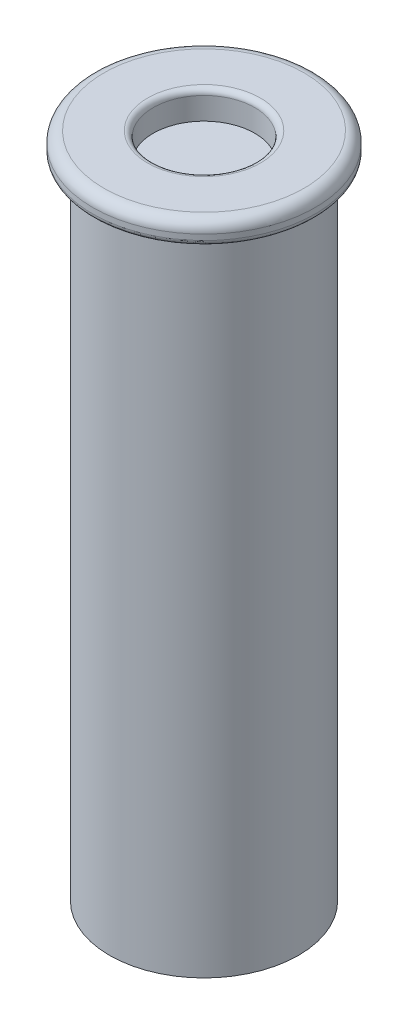
ISO-10303-21;
HEADER;
FILE_DESCRIPTION(('STEP AP214'),'2;1');
FILE_NAME('part.step','',(''),(''),'','','');
FILE_SCHEMA(('AUTOMOTIVE_DESIGN { 1 0 10303 214 1 1 1 1 }'));
ENDSEC;
DATA;
#1=APPLICATION_CONTEXT('core data for automotive mechanical design processes');
#2=APPLICATION_PROTOCOL_DEFINITION('international standard','automotive_design',2000,#1);
#3=PRODUCT_CONTEXT('',#1,'mechanical');
#4=PRODUCT('Part','Part','',(#3));
#5=PRODUCT_RELATED_PRODUCT_CATEGORY('part','',(#4));
#6=PRODUCT_DEFINITION_FORMATION('','',#4);
#7=PRODUCT_DEFINITION_CONTEXT('part definition',#1,'design');
#8=PRODUCT_DEFINITION('design','',#6,#7);
#9=PRODUCT_DEFINITION_SHAPE('','',#8);
#10=(LENGTH_UNIT() NAMED_UNIT(*) SI_UNIT(.MILLI.,.METRE.));
#11=(NAMED_UNIT(*) PLANE_ANGLE_UNIT() SI_UNIT($,.RADIAN.));
#12=(NAMED_UNIT(*) SI_UNIT($,.STERADIAN.) SOLID_ANGLE_UNIT());
#13=UNCERTAINTY_MEASURE_WITH_UNIT(LENGTH_MEASURE(1.E-05),#10,'distance_accuracy_value','');
#14=(GEOMETRIC_REPRESENTATION_CONTEXT(3) GLOBAL_UNCERTAINTY_ASSIGNED_CONTEXT((#13)) GLOBAL_UNIT_ASSIGNED_CONTEXT((#10,
#11,#12)) REPRESENTATION_CONTEXT('',''));
#15=CARTESIAN_POINT('',(0.,0.,0.));
#16=DIRECTION('',(0.,0.,1.));
#17=DIRECTION('',(1.,0.,0.));
#18=AXIS2_PLACEMENT_3D('',#15,#16,#17);
#19=CARTESIAN_POINT('',(0.,0.,0.));
#20=DIRECTION('',(0.,-1.,0.));
#21=DIRECTION('',(0.,0.,-1.));
#22=AXIS2_PLACEMENT_3D('',#19,#20,#21);
#23=CYLINDRICAL_SURFACE('',#22,17.);
#24=CARTESIAN_POINT('',(0.,105.,0.));
#25=DIRECTION('',(0.,-1.,0.));
#26=DIRECTION('',(0.,0.,-1.));
#27=AXIS2_PLACEMENT_3D('',#24,#25,#26);
#28=CIRCLE('',#27,17.);
#29=CARTESIAN_POINT('',(0.,105.,-17.));
#30=VERTEX_POINT('',#29);
#31=EDGE_CURVE('E46',#30,#30,#28,.T.);
#32=ORIENTED_EDGE('',*,*,#31,.T.);
#33=EDGE_LOOP('',(#32));
#34=FACE_BOUND('',#33,.T.);
#35=CARTESIAN_POINT('',(0.,-10.,0.));
#36=DIRECTION('',(0.,-1.,0.));
#37=DIRECTION('',(0.,0.,-1.));
#38=AXIS2_PLACEMENT_3D('',#35,#36,#37);
#39=CIRCLE('',#38,17.);
#40=CARTESIAN_POINT('',(0.,-10.,-17.));
#41=VERTEX_POINT('',#40);
#42=EDGE_CURVE('E70',#41,#41,#39,.T.);
#43=ORIENTED_EDGE('',*,*,#42,.F.);
#44=EDGE_LOOP('',(#43));
#45=FACE_BOUND('',#44,.T.);
#46=ADVANCED_FACE('F38',(#34,#45),#23,.T.);
#47=CARTESIAN_POINT('',(17.,106.,0.));
#48=DIRECTION('',(0.,-1.,0.));
#49=DIRECTION('',(0.,0.,-1.));
#50=AXIS2_PLACEMENT_3D('',#47,#48,#49);
#51=PLANE('',#50);
#52=CARTESIAN_POINT('',(0.,106.,0.));
#53=DIRECTION('',(0.,-1.,0.));
#54=DIRECTION('',(0.,0.,-1.));
#55=AXIS2_PLACEMENT_3D('',#52,#53,#54);
#56=CIRCLE('',#55,18.);
#57=CARTESIAN_POINT('',(0.,106.,-18.));
#58=VERTEX_POINT('',#57);
#59=EDGE_CURVE('E10',#58,#58,#56,.F.);
#60=ORIENTED_EDGE('',*,*,#59,.T.);
#61=EDGE_LOOP('',(#60));
#62=FACE_BOUND('',#61,.T.);
#63=CARTESIAN_POINT('',(0.,106.,0.));
#64=DIRECTION('',(0.,-1.,0.));
#65=DIRECTION('',(0.,0.,-1.));
#66=AXIS2_PLACEMENT_3D('',#63,#64,#65);
#67=CIRCLE('',#66,19.);
#68=CARTESIAN_POINT('',(0.,106.,-19.));
#69=VERTEX_POINT('',#68);
#70=EDGE_CURVE('E55',#69,#69,#67,.T.);
#71=ORIENTED_EDGE('',*,*,#70,.T.);
#72=EDGE_LOOP('',(#71));
#73=FACE_BOUND('',#72,.T.);
#74=ADVANCED_FACE('F105',(#62,#73),#51,.T.);
#75=CARTESIAN_POINT('',(0.,0.,0.));
#76=DIRECTION('',(0.,-1.,0.));
#77=DIRECTION('',(0.,0.,-1.));
#78=AXIS2_PLACEMENT_3D('',#75,#76,#77);
#79=CYLINDRICAL_SURFACE('',#78,20.);
#80=CARTESIAN_POINT('',(0.,107.,0.));
#81=DIRECTION('',(0.,-1.,0.));
#82=DIRECTION('',(0.,0.,-1.));
#83=AXIS2_PLACEMENT_3D('',#80,#81,#82);
#84=CIRCLE('',#83,20.);
#85=CARTESIAN_POINT('',(0.,107.,-20.));
#86=VERTEX_POINT('',#85);
#87=EDGE_CURVE('E50',#86,#86,#84,.F.);
#88=ORIENTED_EDGE('',*,*,#87,.T.);
#89=EDGE_LOOP('',(#88));
#90=FACE_BOUND('',#89,.T.);
#91=CARTESIAN_POINT('',(0.,108.,0.));
#92=DIRECTION('',(0.,1.,0.));
#93=DIRECTION('',(0.,0.,1.));
#94=AXIS2_PLACEMENT_3D('',#91,#92,#93);
#95=CIRCLE('',#94,20.);
#96=CARTESIAN_POINT('',(0.,108.,20.));
#97=VERTEX_POINT('',#96);
#98=EDGE_CURVE('E61',#97,#97,#95,.F.);
#99=ORIENTED_EDGE('',*,*,#98,.T.);
#100=EDGE_LOOP('',(#99));
#101=FACE_BOUND('',#100,.T.);
#102=ADVANCED_FACE('F111',(#90,#101),#79,.T.);
#103=CARTESIAN_POINT('',(20.,110.,0.));
#104=DIRECTION('',(0.,1.,0.));
#105=DIRECTION('',(0.,0.,1.));
#106=AXIS2_PLACEMENT_3D('',#103,#104,#105);
#107=PLANE('',#106);
#108=CARTESIAN_POINT('',(0.,110.,0.));
#109=DIRECTION('',(0.,1.,0.));
#110=DIRECTION('',(0.,0.,1.));
#111=AXIS2_PLACEMENT_3D('',#108,#109,#110);
#112=CIRCLE('',#111,18.);
#113=CARTESIAN_POINT('',(0.,110.,18.));
#114=VERTEX_POINT('',#113);
#115=EDGE_CURVE('E58',#114,#114,#112,.T.);
#116=ORIENTED_EDGE('',*,*,#115,.T.);
#117=EDGE_LOOP('',(#116));
#118=FACE_BOUND('',#117,.T.);
#119=CARTESIAN_POINT('',(0.,110.,0.));
#120=DIRECTION('',(0.,1.,0.));
#121=DIRECTION('',(0.,0.,1.));
#122=AXIS2_PLACEMENT_3D('',#119,#120,#121);
#123=CIRCLE('',#122,10.15);
#124=CARTESIAN_POINT('',(0.,110.,10.15));
#125=VERTEX_POINT('',#124);
#126=EDGE_CURVE('E64',#125,#125,#123,.F.);
#127=ORIENTED_EDGE('',*,*,#126,.T.);
#128=EDGE_LOOP('',(#127));
#129=FACE_BOUND('',#128,.T.);
#130=ADVANCED_FACE('F138',(#118,#129),#107,.T.);
#131=CARTESIAN_POINT('',(0.,-10.,0.));
#132=DIRECTION('',(0.,-1.,0.));
#133=DIRECTION('',(0.,0.,-1.));
#134=AXIS2_PLACEMENT_3D('',#131,#132,#133);
#135=PLANE('',#134);
#136=CARTESIAN_POINT('',(0.,-10.,0.));
#137=DIRECTION('',(0.,-1.,0.));
#138=DIRECTION('',(0.,0.,-1.));
#139=AXIS2_PLACEMENT_3D('',#136,#137,#138);
#140=CIRCLE('',#139,3.25);
#141=CARTESIAN_POINT('',(0.,-10.,-3.25));
#142=VERTEX_POINT('',#141);
#143=EDGE_CURVE('E79',#142,#142,#140,.T.);
#144=ORIENTED_EDGE('',*,*,#143,.F.);
#145=EDGE_LOOP('',(#144));
#146=FACE_BOUND('',#145,.T.);
#147=ORIENTED_EDGE('',*,*,#42,.T.);
#148=EDGE_LOOP('',(#147));
#149=FACE_BOUND('',#148,.T.);
#150=ADVANCED_FACE('F144',(#146,#149),#135,.T.);
#151=CARTESIAN_POINT('',(0.,105.,0.));
#152=DIRECTION('',(0.,1.,0.));
#153=DIRECTION('',(0.,0.,1.));
#154=AXIS2_PLACEMENT_3D('',#151,#152,#153);
#155=CYLINDRICAL_SURFACE('',#154,9.15);
#156=CARTESIAN_POINT('',(0.,109.,0.));
#157=DIRECTION('',(0.,1.,0.));
#158=DIRECTION('',(0.,0.,1.));
#159=AXIS2_PLACEMENT_3D('',#156,#157,#158);
#160=CIRCLE('',#159,9.15);
#161=CARTESIAN_POINT('',(0.,109.,9.15));
#162=VERTEX_POINT('',#161);
#163=EDGE_CURVE('E67',#162,#162,#160,.T.);
#164=ORIENTED_EDGE('',*,*,#163,.T.);
#165=EDGE_LOOP('',(#164));
#166=FACE_BOUND('',#165,.T.);
#167=CARTESIAN_POINT('',(0.,105.,0.));
#168=DIRECTION('',(0.,1.,0.));
#169=DIRECTION('',(0.,0.,1.));
#170=AXIS2_PLACEMENT_3D('',#167,#168,#169);
#171=CIRCLE('',#170,9.15);
#172=CARTESIAN_POINT('',(0.,105.,9.15));
#173=VERTEX_POINT('',#172);
#174=EDGE_CURVE('E73',#173,#173,#171,.T.);
#175=ORIENTED_EDGE('',*,*,#174,.F.);
#176=EDGE_LOOP('',(#175));
#177=FACE_BOUND('',#176,.T.);
#178=ADVANCED_FACE('F150',(#166,#177),#155,.F.);
#179=CARTESIAN_POINT('',(0.,105.,0.));
#180=DIRECTION('',(0.,1.,0.));
#181=DIRECTION('',(0.,0.,1.));
#182=AXIS2_PLACEMENT_3D('',#179,#180,#181);
#183=PLANE('',#182);
#184=ORIENTED_EDGE('',*,*,#174,.T.);
#185=EDGE_LOOP('',(#184));
#186=FACE_BOUND('',#185,.T.);
#187=ADVANCED_FACE('F120',(#186),#183,.T.);
#188=CARTESIAN_POINT('',(0.,109.,0.));
#189=DIRECTION('',(0.,1.,0.));
#190=DIRECTION('',(0.,0.,1.));
#191=AXIS2_PLACEMENT_3D('',#188,#189,#190);
#192=TOROIDAL_SURFACE('',#191,10.15,1.);
#193=ORIENTED_EDGE('',*,*,#126,.F.);
#194=EDGE_LOOP('',(#193));
#195=FACE_BOUND('',#194,.T.);
#196=ORIENTED_EDGE('',*,*,#163,.F.);
#197=EDGE_LOOP('',(#196));
#198=FACE_BOUND('',#197,.T.);
#199=ADVANCED_FACE('F116',(#195,#198),#192,.T.);
#200=CARTESIAN_POINT('',(0.,108.,0.));
#201=DIRECTION('',(0.,1.,0.));
#202=DIRECTION('',(0.,0.,1.));
#203=AXIS2_PLACEMENT_3D('',#200,#201,#202);
#204=TOROIDAL_SURFACE('',#203,18.,2.);
#205=ORIENTED_EDGE('',*,*,#115,.F.);
#206=EDGE_LOOP('',(#205));
#207=FACE_BOUND('',#206,.T.);
#208=ORIENTED_EDGE('',*,*,#98,.F.);
#209=EDGE_LOOP('',(#208));
#210=FACE_BOUND('',#209,.T.);
#211=ADVANCED_FACE('F119',(#207,#210),#204,.T.);
#212=CARTESIAN_POINT('',(0.,107.,0.));
#213=DIRECTION('',(0.,-1.,0.));
#214=DIRECTION('',(0.,0.,-1.));
#215=AXIS2_PLACEMENT_3D('',#212,#213,#214);
#216=TOROIDAL_SURFACE('',#215,19.,1.);
#217=ORIENTED_EDGE('',*,*,#87,.F.);
#218=EDGE_LOOP('',(#217));
#219=FACE_BOUND('',#218,.T.);
#220=ORIENTED_EDGE('',*,*,#70,.F.);
#221=EDGE_LOOP('',(#220));
#222=FACE_BOUND('',#221,.T.);
#223=ADVANCED_FACE('F123',(#219,#222),#216,.T.);
#224=CARTESIAN_POINT('',(0.,105.,0.));
#225=DIRECTION('',(0.,-1.,0.));
#226=DIRECTION('',(0.,0.,-1.));
#227=AXIS2_PLACEMENT_3D('',#224,#225,#226);
#228=TOROIDAL_SURFACE('',#227,18.,1.);
#229=ORIENTED_EDGE('',*,*,#59,.F.);
#230=EDGE_LOOP('',(#229));
#231=FACE_BOUND('',#230,.T.);
#232=ORIENTED_EDGE('',*,*,#31,.F.);
#233=EDGE_LOOP('',(#232));
#234=FACE_BOUND('',#233,.T.);
#235=ADVANCED_FACE('F40',(#231,#234),#228,.F.);
#236=CARTESIAN_POINT('',(0.,-9.,0.));
#237=DIRECTION('',(0.,-1.,0.));
#238=DIRECTION('',(0.,0.,-1.));
#239=AXIS2_PLACEMENT_3D('',#236,#237,#238);
#240=PLANE('',#239);
#241=CARTESIAN_POINT('',(0.,-9.,0.));
#242=DIRECTION('',(0.,-1.,0.));
#243=DIRECTION('',(0.,0.,-1.));
#244=AXIS2_PLACEMENT_3D('',#241,#242,#243);
#245=CIRCLE('',#244,3.25);
#246=CARTESIAN_POINT('',(0.,-9.,-3.25));
#247=VERTEX_POINT('',#246);
#248=EDGE_CURVE('E82',#247,#247,#245,.T.);
#249=ORIENTED_EDGE('',*,*,#248,.T.);
#250=EDGE_LOOP('',(#249));
#251=FACE_BOUND('',#250,.T.);
#252=CARTESIAN_POINT('',(0.,-9.,0.));
#253=DIRECTION('',(0.,-1.,0.));
#254=DIRECTION('',(0.,0.,-1.));
#255=AXIS2_PLACEMENT_3D('',#252,#253,#254);
#256=CIRCLE('',#255,2.75);
#257=CARTESIAN_POINT('',(0.,-9.,-2.75));
#258=VERTEX_POINT('',#257);
#259=EDGE_CURVE('E42',#258,#258,#256,.F.);
#260=ORIENTED_EDGE('',*,*,#259,.T.);
#261=EDGE_LOOP('',(#260));
#262=FACE_BOUND('',#261,.T.);
#263=ADVANCED_FACE('F89',(#251,#262),#240,.T.);
#264=CARTESIAN_POINT('',(0.,-9.,0.));
#265=DIRECTION('',(0.,-1.,0.));
#266=DIRECTION('',(0.,0.,-1.));
#267=AXIS2_PLACEMENT_3D('',#264,#265,#266);
#268=CYLINDRICAL_SURFACE('',#267,3.25);
#269=ORIENTED_EDGE('',*,*,#248,.F.);
#270=EDGE_LOOP('',(#269));
#271=FACE_BOUND('',#270,.T.);
#272=ORIENTED_EDGE('',*,*,#143,.T.);
#273=EDGE_LOOP('',(#272));
#274=FACE_BOUND('',#273,.T.);
#275=ADVANCED_FACE('F99',(#271,#274),#268,.F.);
#276=CARTESIAN_POINT('',(0.,2.,0.));
#277=DIRECTION('',(0.,-1.,0.));
#278=DIRECTION('',(0.,0.,-1.));
#279=AXIS2_PLACEMENT_3D('',#276,#277,#278);
#280=PLANE('',#279);
#281=CARTESIAN_POINT('',(0.,2.,0.));
#282=DIRECTION('',(0.,-1.,0.));
#283=DIRECTION('',(0.,0.,-1.));
#284=AXIS2_PLACEMENT_3D('',#281,#282,#283);
#285=CIRCLE('',#284,2.75);
#286=CARTESIAN_POINT('',(0.,2.,-2.75));
#287=VERTEX_POINT('',#286);
#288=EDGE_CURVE('E76',#287,#287,#285,.T.);
#289=ORIENTED_EDGE('',*,*,#288,.T.);
#290=EDGE_LOOP('',(#289));
#291=FACE_BOUND('',#290,.T.);
#292=ADVANCED_FACE('F93',(#291),#280,.T.);
#293=CARTESIAN_POINT('',(0.,2.,0.));
#294=DIRECTION('',(0.,-1.,0.));
#295=DIRECTION('',(0.,0.,-1.));
#296=AXIS2_PLACEMENT_3D('',#293,#294,#295);
#297=CYLINDRICAL_SURFACE('',#296,2.75);
#298=ORIENTED_EDGE('',*,*,#288,.F.);
#299=EDGE_LOOP('',(#298));
#300=FACE_BOUND('',#299,.T.);
#301=ORIENTED_EDGE('',*,*,#259,.F.);
#302=EDGE_LOOP('',(#301));
#303=FACE_BOUND('',#302,.T.);
#304=ADVANCED_FACE('F91',(#300,#303),#297,.F.);
#305=CLOSED_SHELL('',(#46,#74,#102,#130,#150,#178,#187,#199,#211,#223,#235,#263,#275,#292,#304));
#306=MANIFOLD_SOLID_BREP('B2',#305);
#307=ADVANCED_BREP_SHAPE_REPRESENTATION('',(#18,#306),#14);
#308=SHAPE_DEFINITION_REPRESENTATION(#9,#307);
ENDSEC;
END-ISO-10303-21;
